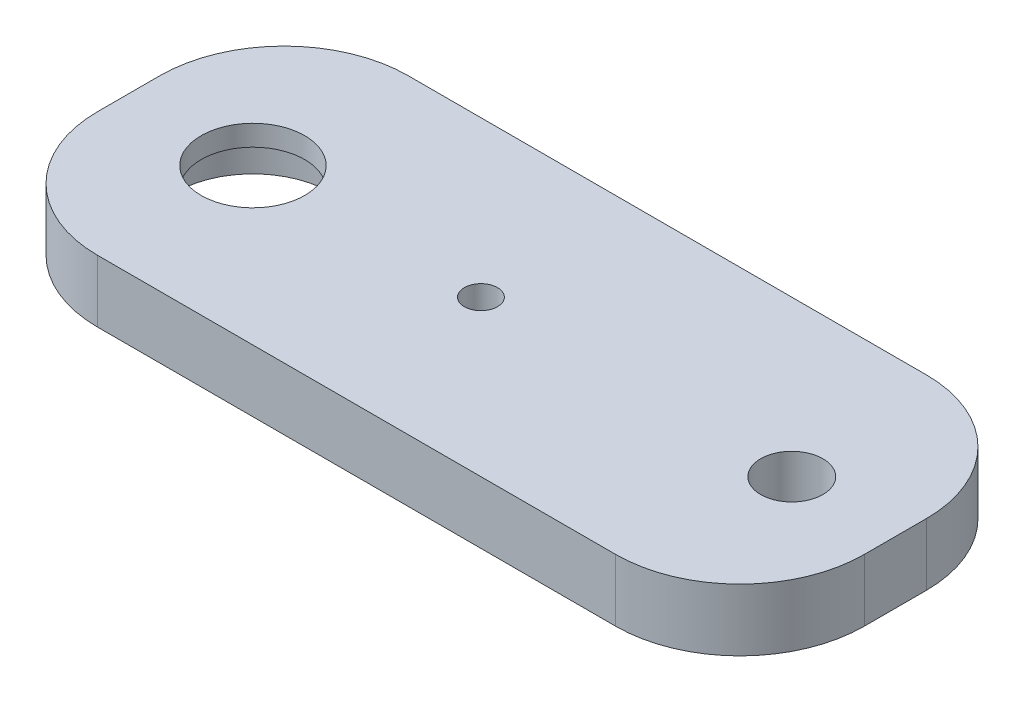
ISO-10303-21;
HEADER;
FILE_DESCRIPTION(('STEP AP214'),'2;1');
FILE_NAME('part.step','',(''),(''),'','','');
FILE_SCHEMA(('AUTOMOTIVE_DESIGN { 1 0 10303 214 1 1 1 1 }'));
ENDSEC;
DATA;
#1=APPLICATION_CONTEXT('core data for automotive mechanical design processes');
#2=APPLICATION_PROTOCOL_DEFINITION('international standard','automotive_design',2000,#1);
#3=PRODUCT_CONTEXT('',#1,'mechanical');
#4=PRODUCT('Part','Part','',(#3));
#5=PRODUCT_RELATED_PRODUCT_CATEGORY('part','',(#4));
#6=PRODUCT_DEFINITION_FORMATION('','',#4);
#7=PRODUCT_DEFINITION_CONTEXT('part definition',#1,'design');
#8=PRODUCT_DEFINITION('design','',#6,#7);
#9=PRODUCT_DEFINITION_SHAPE('','',#8);
#10=(LENGTH_UNIT() NAMED_UNIT(*) SI_UNIT(.MILLI.,.METRE.));
#11=(NAMED_UNIT(*) PLANE_ANGLE_UNIT() SI_UNIT($,.RADIAN.));
#12=(NAMED_UNIT(*) SI_UNIT($,.STERADIAN.) SOLID_ANGLE_UNIT());
#13=UNCERTAINTY_MEASURE_WITH_UNIT(LENGTH_MEASURE(1.E-05),#10,'distance_accuracy_value','');
#14=(GEOMETRIC_REPRESENTATION_CONTEXT(3) GLOBAL_UNCERTAINTY_ASSIGNED_CONTEXT((#13)) GLOBAL_UNIT_ASSIGNED_CONTEXT((#10,
#11,#12)) REPRESENTATION_CONTEXT('',''));
#15=CARTESIAN_POINT('',(0.,0.,0.));
#16=DIRECTION('',(0.,0.,1.));
#17=DIRECTION('',(1.,0.,0.));
#18=AXIS2_PLACEMENT_3D('',#15,#16,#17);
#19=CARTESIAN_POINT('',(0.,3.,0.));
#20=DIRECTION('',(0.,1.,0.));
#21=DIRECTION('',(0.,0.,1.));
#22=AXIS2_PLACEMENT_3D('',#19,#20,#21);
#23=PLANE('',#22);
#24=CARTESIAN_POINT('',(17.,3.,0.));
#25=DIRECTION('',(0.,1.,0.));
#26=DIRECTION('',(0.,0.,1.));
#27=AXIS2_PLACEMENT_3D('',#24,#25,#26);
#28=CIRCLE('',#27,1.5);
#29=CARTESIAN_POINT('',(17.,3.,1.5));
#30=VERTEX_POINT('',#29);
#31=EDGE_CURVE('E323',#30,#30,#28,.T.);
#32=ORIENTED_EDGE('',*,*,#31,.F.);
#33=EDGE_LOOP('',(#32));
#34=FACE_BOUND('',#33,.T.);
#35=CARTESIAN_POINT('',(1.99999999999999,3.,0.));
#36=DIRECTION('',(0.,1.,0.));
#37=DIRECTION('',(0.,0.,1.));
#38=AXIS2_PLACEMENT_3D('',#35,#36,#37);
#39=CIRCLE('',#38,0.8);
#40=CARTESIAN_POINT('',(1.99999999999999,3.,0.8));
#41=VERTEX_POINT('',#40);
#42=EDGE_CURVE('E157',#41,#41,#39,.F.);
#43=ORIENTED_EDGE('',*,*,#42,.T.);
#44=EDGE_LOOP('',(#43));
#45=FACE_BOUND('',#44,.T.);
#46=CARTESIAN_POINT('',(-9.00000000000001,3.,0.));
#47=DIRECTION('',(0.,1.,0.));
#48=DIRECTION('',(0.,0.,1.));
#49=AXIS2_PLACEMENT_3D('',#46,#47,#48);
#50=CIRCLE('',#49,2.5);
#51=CARTESIAN_POINT('',(-9.00000000000001,3.,2.5));
#52=VERTEX_POINT('',#51);
#53=EDGE_CURVE('E176',#52,#52,#50,.T.);
#54=ORIENTED_EDGE('',*,*,#53,.F.);
#55=EDGE_LOOP('',(#54));
#56=FACE_BOUND('',#55,.T.);
#57=DIRECTION('',(1.,0.,0.));
#58=VECTOR('',#57,1.);
#59=CARTESIAN_POINT('',(-15.,3.,7.5));
#60=LINE('',#59,#58);
#61=CARTESIAN_POINT('',(-9.,3.,7.5));
#62=VERTEX_POINT('',#61);
#63=CARTESIAN_POINT('',(16.,3.,7.5));
#64=VERTEX_POINT('',#63);
#65=EDGE_CURVE('E186',#62,#64,#60,.T.);
#66=ORIENTED_EDGE('',*,*,#65,.T.);
#67=CARTESIAN_POINT('',(16.,3.,1.5));
#68=DIRECTION('',(0.,1.,0.));
#69=DIRECTION('',(0.,0.,1.));
#70=AXIS2_PLACEMENT_3D('',#67,#68,#69);
#71=CIRCLE('',#70,6.);
#72=CARTESIAN_POINT('',(22.,3.,1.5));
#73=VERTEX_POINT('',#72);
#74=EDGE_CURVE('E47',#64,#73,#71,.T.);
#75=ORIENTED_EDGE('',*,*,#74,.T.);
#76=DIRECTION('',(0.,0.,1.));
#77=VECTOR('',#76,1.);
#78=CARTESIAN_POINT('',(22.,3.,7.5));
#79=LINE('',#78,#77);
#80=CARTESIAN_POINT('',(22.,3.,-1.5));
#81=VERTEX_POINT('',#80);
#82=EDGE_CURVE('E230',#81,#73,#79,.T.);
#83=ORIENTED_EDGE('',*,*,#82,.F.);
#84=CARTESIAN_POINT('',(16.,3.,-1.5));
#85=DIRECTION('',(0.,1.,0.));
#86=DIRECTION('',(0.,0.,1.));
#87=AXIS2_PLACEMENT_3D('',#84,#85,#86);
#88=CIRCLE('',#87,6.);
#89=CARTESIAN_POINT('',(16.,3.,-7.5));
#90=VERTEX_POINT('',#89);
#91=EDGE_CURVE('E54',#81,#90,#88,.T.);
#92=ORIENTED_EDGE('',*,*,#91,.T.);
#93=DIRECTION('',(-1.,0.,0.));
#94=VECTOR('',#93,1.);
#95=CARTESIAN_POINT('',(-15.,3.,-7.5));
#96=LINE('',#95,#94);
#97=CARTESIAN_POINT('',(-9.,3.,-7.5));
#98=VERTEX_POINT('',#97);
#99=EDGE_CURVE('E180',#90,#98,#96,.T.);
#100=ORIENTED_EDGE('',*,*,#99,.T.);
#101=CARTESIAN_POINT('',(-9.,3.,-1.5));
#102=DIRECTION('',(0.,1.,0.));
#103=DIRECTION('',(0.,0.,1.));
#104=AXIS2_PLACEMENT_3D('',#101,#102,#103);
#105=CIRCLE('',#104,6.);
#106=CARTESIAN_POINT('',(-15.,3.,-1.5));
#107=VERTEX_POINT('',#106);
#108=EDGE_CURVE('E206',#98,#107,#105,.T.);
#109=ORIENTED_EDGE('',*,*,#108,.T.);
#110=DIRECTION('',(0.,0.,1.));
#111=VECTOR('',#110,1.);
#112=CARTESIAN_POINT('',(-15.,3.,-7.5));
#113=LINE('',#112,#111);
#114=CARTESIAN_POINT('',(-15.,3.,1.5));
#115=VERTEX_POINT('',#114);
#116=EDGE_CURVE('E182',#107,#115,#113,.T.);
#117=ORIENTED_EDGE('',*,*,#116,.T.);
#118=CARTESIAN_POINT('',(-9.,3.,1.5));
#119=DIRECTION('',(0.,1.,0.));
#120=DIRECTION('',(0.,0.,1.));
#121=AXIS2_PLACEMENT_3D('',#118,#119,#120);
#122=CIRCLE('',#121,6.);
#123=EDGE_CURVE('E208',#115,#62,#122,.T.);
#124=ORIENTED_EDGE('',*,*,#123,.T.);
#125=EDGE_LOOP('',(#66,#75,#83,#92,#100,#109,#117,#124));
#126=FACE_BOUND('',#125,.T.);
#127=ADVANCED_FACE('F39',(#34,#45,#56,#126),#23,.T.);
#128=CARTESIAN_POINT('',(0.,0.,0.));
#129=DIRECTION('',(0.,1.,0.));
#130=DIRECTION('',(0.,0.,1.));
#131=AXIS2_PLACEMENT_3D('',#128,#129,#130);
#132=PLANE('',#131);
#133=CARTESIAN_POINT('',(17.,0.,0.));
#134=DIRECTION('',(0.,1.,0.));
#135=DIRECTION('',(0.,0.,1.));
#136=AXIS2_PLACEMENT_3D('',#133,#134,#135);
#137=CIRCLE('',#136,1.5);
#138=CARTESIAN_POINT('',(17.,0.,1.5));
#139=VERTEX_POINT('',#138);
#140=EDGE_CURVE('E239',#139,#139,#137,.F.);
#141=ORIENTED_EDGE('',*,*,#140,.F.);
#142=EDGE_LOOP('',(#141));
#143=FACE_BOUND('',#142,.T.);
#144=DIRECTION('',(0.,0.,1.));
#145=VECTOR('',#144,1.);
#146=CARTESIAN_POINT('',(11.,0.,-3.75));
#147=LINE('',#146,#145);
#148=CARTESIAN_POINT('',(11.,0.,-3.75));
#149=VERTEX_POINT('',#148);
#150=CARTESIAN_POINT('',(11.,0.,3.75));
#151=VERTEX_POINT('',#150);
#152=EDGE_CURVE('E136',#149,#151,#147,.T.);
#153=ORIENTED_EDGE('',*,*,#152,.F.);
#154=DIRECTION('',(1.,0.,0.));
#155=VECTOR('',#154,1.);
#156=CARTESIAN_POINT('',(-9.,0.,-3.75));
#157=LINE('',#156,#155);
#158=CARTESIAN_POINT('',(-9.,0.,-3.75));
#159=VERTEX_POINT('',#158);
#160=EDGE_CURVE('E151',#159,#149,#157,.T.);
#161=ORIENTED_EDGE('',*,*,#160,.F.);
#162=CARTESIAN_POINT('',(-9.00000000000001,0.,0.));
#163=DIRECTION('',(0.,-1.,0.));
#164=DIRECTION('',(0.,0.,-1.));
#165=AXIS2_PLACEMENT_3D('',#162,#163,#164);
#166=CIRCLE('',#165,3.75);
#167=CARTESIAN_POINT('',(-9.,0.,3.75));
#168=VERTEX_POINT('',#167);
#169=EDGE_CURVE('E166',#168,#159,#166,.T.);
#170=ORIENTED_EDGE('',*,*,#169,.F.);
#171=DIRECTION('',(-1.,0.,0.));
#172=VECTOR('',#171,1.);
#173=CARTESIAN_POINT('',(-9.,0.,3.75));
#174=LINE('',#173,#172);
#175=EDGE_CURVE('E154',#151,#168,#174,.T.);
#176=ORIENTED_EDGE('',*,*,#175,.F.);
#177=EDGE_LOOP('',(#153,#161,#170,#176));
#178=FACE_BOUND('',#177,.T.);
#179=DIRECTION('',(0.,0.,-1.));
#180=VECTOR('',#179,1.);
#181=CARTESIAN_POINT('',(22.,0.,7.5));
#182=LINE('',#181,#180);
#183=CARTESIAN_POINT('',(22.,0.,1.5));
#184=VERTEX_POINT('',#183);
#185=CARTESIAN_POINT('',(22.,0.,-1.5));
#186=VERTEX_POINT('',#185);
#187=EDGE_CURVE('E238',#184,#186,#182,.T.);
#188=ORIENTED_EDGE('',*,*,#187,.F.);
#189=CARTESIAN_POINT('',(16.,0.,1.5));
#190=DIRECTION('',(0.,1.,0.));
#191=DIRECTION('',(0.,0.,1.));
#192=AXIS2_PLACEMENT_3D('',#189,#190,#191);
#193=CIRCLE('',#192,6.);
#194=CARTESIAN_POINT('',(16.,0.,7.5));
#195=VERTEX_POINT('',#194);
#196=EDGE_CURVE('E225',#184,#195,#193,.F.);
#197=ORIENTED_EDGE('',*,*,#196,.T.);
#198=DIRECTION('',(1.,0.,0.));
#199=VECTOR('',#198,1.);
#200=CARTESIAN_POINT('',(-15.,0.,7.5));
#201=LINE('',#200,#199);
#202=CARTESIAN_POINT('',(-9.,0.,7.5));
#203=VERTEX_POINT('',#202);
#204=EDGE_CURVE('E183',#203,#195,#201,.T.);
#205=ORIENTED_EDGE('',*,*,#204,.F.);
#206=CARTESIAN_POINT('',(-9.,0.,1.5));
#207=DIRECTION('',(0.,1.,0.));
#208=DIRECTION('',(0.,0.,1.));
#209=AXIS2_PLACEMENT_3D('',#206,#207,#208);
#210=CIRCLE('',#209,6.);
#211=CARTESIAN_POINT('',(-15.,0.,1.5));
#212=VERTEX_POINT('',#211);
#213=EDGE_CURVE('E199',#203,#212,#210,.F.);
#214=ORIENTED_EDGE('',*,*,#213,.T.);
#215=DIRECTION('',(0.,0.,1.));
#216=VECTOR('',#215,1.);
#217=CARTESIAN_POINT('',(-15.,0.,-7.5));
#218=LINE('',#217,#216);
#219=CARTESIAN_POINT('',(-15.,0.,-1.5));
#220=VERTEX_POINT('',#219);
#221=EDGE_CURVE('E190',#220,#212,#218,.T.);
#222=ORIENTED_EDGE('',*,*,#221,.F.);
#223=CARTESIAN_POINT('',(-9.,0.,-1.5));
#224=DIRECTION('',(0.,1.,0.));
#225=DIRECTION('',(0.,0.,1.));
#226=AXIS2_PLACEMENT_3D('',#223,#224,#225);
#227=CIRCLE('',#226,6.);
#228=CARTESIAN_POINT('',(-9.,0.,-7.5));
#229=VERTEX_POINT('',#228);
#230=EDGE_CURVE('E196',#220,#229,#227,.F.);
#231=ORIENTED_EDGE('',*,*,#230,.T.);
#232=DIRECTION('',(-1.,0.,0.));
#233=VECTOR('',#232,1.);
#234=CARTESIAN_POINT('',(-15.,0.,-7.5));
#235=LINE('',#234,#233);
#236=CARTESIAN_POINT('',(16.,0.,-7.5));
#237=VERTEX_POINT('',#236);
#238=EDGE_CURVE('E179',#237,#229,#235,.T.);
#239=ORIENTED_EDGE('',*,*,#238,.F.);
#240=CARTESIAN_POINT('',(16.,0.,-1.5));
#241=DIRECTION('',(0.,1.,0.));
#242=DIRECTION('',(0.,0.,1.));
#243=AXIS2_PLACEMENT_3D('',#240,#241,#242);
#244=CIRCLE('',#243,6.);
#245=EDGE_CURVE('E223',#237,#186,#244,.F.);
#246=ORIENTED_EDGE('',*,*,#245,.T.);
#247=EDGE_LOOP('',(#188,#197,#205,#214,#222,#231,#239,#246));
#248=FACE_BOUND('',#247,.T.);
#249=ADVANCED_FACE('F244',(#143,#178,#248),#132,.F.);
#250=CARTESIAN_POINT('',(-9.00000000000001,-0.00100000000000013,0.));
#251=DIRECTION('',(0.,1.,0.));
#252=DIRECTION('',(0.,0.,1.));
#253=AXIS2_PLACEMENT_3D('',#250,#251,#252);
#254=CYLINDRICAL_SURFACE('',#253,2.5);
#255=CARTESIAN_POINT('',(-9.00000000000001,2.,0.));
#256=DIRECTION('',(0.,-1.,0.));
#257=DIRECTION('',(0.,0.,-1.));
#258=AXIS2_PLACEMENT_3D('',#255,#256,#257);
#259=CIRCLE('',#258,2.5);
#260=CARTESIAN_POINT('',(-9.00000000000001,2.,2.5));
#261=VERTEX_POINT('',#260);
#262=EDGE_CURVE('E173',#261,#261,#259,.F.);
#263=CARTESIAN_POINT('',(-9.00000000000001,3.,2.5));
#264=CARTESIAN_POINT('',(-9.00000000000001,2.98958333333333,2.5));
#265=CARTESIAN_POINT('',(-9.00000000000001,2.97916666666667,2.5));
#266=CARTESIAN_POINT('',(-9.00000000000001,2.95833333333333,2.5));
#267=CARTESIAN_POINT('',(-9.00000000000001,2.94791666666667,2.5));
#268=CARTESIAN_POINT('',(-9.00000000000001,2.92708333333333,2.5));
#269=CARTESIAN_POINT('',(-9.00000000000001,2.91666666666667,2.5));
#270=CARTESIAN_POINT('',(-9.00000000000001,2.89583333333333,2.5));
#271=CARTESIAN_POINT('',(-9.00000000000001,2.88541666666667,2.5));
#272=CARTESIAN_POINT('',(-9.00000000000001,2.86458333333333,2.5));
#273=CARTESIAN_POINT('',(-9.00000000000001,2.85416666666667,2.5));
#274=CARTESIAN_POINT('',(-9.00000000000001,2.83333333333333,2.5));
#275=CARTESIAN_POINT('',(-9.00000000000001,2.82291666666667,2.5));
#276=CARTESIAN_POINT('',(-9.00000000000001,2.80208333333333,2.5));
#277=CARTESIAN_POINT('',(-9.00000000000001,2.79166666666667,2.5));
#278=CARTESIAN_POINT('',(-9.00000000000001,2.77083333333333,2.5));
#279=CARTESIAN_POINT('',(-9.00000000000001,2.76041666666667,2.5));
#280=CARTESIAN_POINT('',(-9.00000000000001,2.73958333333333,2.5));
#281=CARTESIAN_POINT('',(-9.00000000000001,2.72916666666667,2.5));
#282=CARTESIAN_POINT('',(-9.00000000000001,2.70833333333333,2.5));
#283=CARTESIAN_POINT('',(-9.00000000000001,2.69791666666667,2.5));
#284=CARTESIAN_POINT('',(-9.00000000000001,2.67708333333333,2.5));
#285=CARTESIAN_POINT('',(-9.00000000000001,2.66666666666667,2.5));
#286=CARTESIAN_POINT('',(-9.00000000000001,2.64583333333333,2.5));
#287=CARTESIAN_POINT('',(-9.00000000000001,2.63541666666667,2.5));
#288=CARTESIAN_POINT('',(-9.00000000000001,2.61458333333333,2.5));
#289=CARTESIAN_POINT('',(-9.00000000000001,2.60416666666667,2.5));
#290=CARTESIAN_POINT('',(-9.00000000000001,2.58333333333333,2.5));
#291=CARTESIAN_POINT('',(-9.00000000000001,2.57291666666667,2.5));
#292=CARTESIAN_POINT('',(-9.00000000000001,2.55208333333333,2.5));
#293=CARTESIAN_POINT('',(-9.00000000000001,2.54166666666667,2.5));
#294=CARTESIAN_POINT('',(-9.00000000000001,2.52083333333333,2.5));
#295=CARTESIAN_POINT('',(-9.00000000000001,2.51041666666667,2.5));
#296=CARTESIAN_POINT('',(-9.00000000000001,2.48958333333333,2.5));
#297=CARTESIAN_POINT('',(-9.00000000000001,2.47916666666667,2.5));
#298=CARTESIAN_POINT('',(-9.00000000000001,2.45833333333333,2.5));
#299=CARTESIAN_POINT('',(-9.00000000000001,2.44791666666667,2.5));
#300=CARTESIAN_POINT('',(-9.00000000000001,2.42708333333333,2.5));
#301=CARTESIAN_POINT('',(-9.00000000000001,2.41666666666667,2.5));
#302=CARTESIAN_POINT('',(-9.00000000000001,2.39583333333333,2.5));
#303=CARTESIAN_POINT('',(-9.00000000000001,2.38541666666667,2.5));
#304=CARTESIAN_POINT('',(-9.00000000000001,2.36458333333333,2.5));
#305=CARTESIAN_POINT('',(-9.00000000000001,2.35416666666667,2.5));
#306=CARTESIAN_POINT('',(-9.00000000000001,2.33333333333333,2.5));
#307=CARTESIAN_POINT('',(-9.00000000000001,2.32291666666667,2.5));
#308=CARTESIAN_POINT('',(-9.00000000000001,2.30208333333333,2.5));
#309=CARTESIAN_POINT('',(-9.00000000000001,2.29166666666667,2.5));
#310=CARTESIAN_POINT('',(-9.00000000000001,2.27083333333333,2.5));
#311=CARTESIAN_POINT('',(-9.00000000000001,2.26041666666667,2.5));
#312=CARTESIAN_POINT('',(-9.00000000000001,2.23958333333333,2.5));
#313=CARTESIAN_POINT('',(-9.00000000000001,2.22916666666667,2.5));
#314=CARTESIAN_POINT('',(-9.00000000000001,2.20833333333333,2.5));
#315=CARTESIAN_POINT('',(-9.00000000000001,2.19791666666667,2.5));
#316=CARTESIAN_POINT('',(-9.00000000000001,2.17708333333333,2.5));
#317=CARTESIAN_POINT('',(-9.00000000000001,2.16666666666667,2.5));
#318=CARTESIAN_POINT('',(-9.00000000000001,2.14583333333333,2.5));
#319=CARTESIAN_POINT('',(-9.00000000000001,2.13541666666667,2.5));
#320=CARTESIAN_POINT('',(-9.00000000000001,2.11458333333333,2.5));
#321=CARTESIAN_POINT('',(-9.00000000000001,2.10416666666667,2.5));
#322=CARTESIAN_POINT('',(-9.00000000000001,2.08333333333333,2.5));
#323=CARTESIAN_POINT('',(-9.00000000000001,2.07291666666667,2.5));
#324=CARTESIAN_POINT('',(-9.00000000000001,2.05208333333333,2.5));
#325=CARTESIAN_POINT('',(-9.00000000000001,2.04166666666667,2.5));
#326=CARTESIAN_POINT('',(-9.00000000000001,2.02083333333333,2.5));
#327=CARTESIAN_POINT('',(-9.00000000000001,2.01041666666667,2.5));
#328=CARTESIAN_POINT('',(-9.00000000000001,2.,2.5));
#329=B_SPLINE_CURVE_WITH_KNOTS('',3,(#263,#264,#265,#266,#267,#268,#269,#270,#271,#272,#273,
#274,#275,#276,#277,#278,#279,#280,#281,#282,#283,#284,#285,#286,#287,#288,#289,#290,#291,#292,
#293,#294,#295,#296,#297,#298,#299,#300,#301,#302,#303,#304,#305,#306,#307,#308,#309,#310,#311,
#312,#313,#314,#315,#316,#317,#318,#319,#320,#321,#322,#323,#324,#325,#326,#327,#328),
.UNSPECIFIED.,.F.,.F.,(4,2,2,2,2,2,2,2,2,2,2,2,2,2,2,2,2,2,2,2,2,2,2,2,2,2,2,2,2,2,2,2,4),(0.,
0.03125,0.0625000000000001,0.0937500000000001,0.125,0.15625,0.1875,0.21875,0.25,0.28125,0.3125,
0.34375,0.374999999999999,0.40625,0.4375,0.46875,0.5,0.53125,0.5625,0.59375,0.625,0.65625,
0.687499999999999,0.718749999999999,0.749999999999999,0.781249999999999,0.812499999999999,
0.843749999999999,0.874999999999999,0.906249999999999,0.937499999999999,0.968749999999999,
0.999999999999999),.UNSPECIFIED.);
#330=EDGE_CURVE('BSEAM274',#52,#261,#329,.T.);
#331=ORIENTED_EDGE('',*,*,#53,.T.);
#332=ORIENTED_EDGE('',*,*,#262,.F.);
#333=ORIENTED_EDGE('',*,*,#330,.T.);
#334=ORIENTED_EDGE('',*,*,#330,.F.);
#335=EDGE_LOOP('',(#331,#333,#332,#334));
#336=FACE_BOUND('',#335,.T.);
#337=ADVANCED_FACE('F274',(#336),#254,.F.);
#338=CARTESIAN_POINT('',(-15.,3.,7.5));
#339=DIRECTION('',(0.,0.,-1.));
#340=DIRECTION('',(-1.,0.,0.));
#341=AXIS2_PLACEMENT_3D('',#338,#339,#340);
#342=PLANE('',#341);
#343=ORIENTED_EDGE('',*,*,#204,.T.);
#344=DIRECTION('',(0.,-1.,0.));
#345=VECTOR('',#344,1.);
#346=CARTESIAN_POINT('',(16.,3.,7.5));
#347=LINE('',#346,#345);
#348=EDGE_CURVE('E62',#195,#64,#347,.F.);
#349=ORIENTED_EDGE('',*,*,#348,.T.);
#350=ORIENTED_EDGE('',*,*,#65,.F.);
#351=DIRECTION('',(0.,-1.,0.));
#352=VECTOR('',#351,1.);
#353=CARTESIAN_POINT('',(-9.,3.,7.5));
#354=LINE('',#353,#352);
#355=EDGE_CURVE('E188',#62,#203,#354,.T.);
#356=ORIENTED_EDGE('',*,*,#355,.T.);
#357=EDGE_LOOP('',(#343,#349,#350,#356));
#358=FACE_BOUND('',#357,.T.);
#359=ADVANCED_FACE('F245',(#358),#342,.F.);
#360=CARTESIAN_POINT('',(-15.,3.,-7.5));
#361=DIRECTION('',(0.,0.,1.));
#362=DIRECTION('',(1.,0.,0.));
#363=AXIS2_PLACEMENT_3D('',#360,#361,#362);
#364=PLANE('',#363);
#365=ORIENTED_EDGE('',*,*,#99,.F.);
#366=DIRECTION('',(0.,1.,0.));
#367=VECTOR('',#366,1.);
#368=CARTESIAN_POINT('',(16.,0.,-7.5));
#369=LINE('',#368,#367);
#370=EDGE_CURVE('E11',#90,#237,#369,.F.);
#371=ORIENTED_EDGE('',*,*,#370,.T.);
#372=ORIENTED_EDGE('',*,*,#238,.T.);
#373=DIRECTION('',(0.,-1.,0.));
#374=VECTOR('',#373,1.);
#375=CARTESIAN_POINT('',(-9.,3.,-7.5));
#376=LINE('',#375,#374);
#377=EDGE_CURVE('E210',#229,#98,#376,.F.);
#378=ORIENTED_EDGE('',*,*,#377,.T.);
#379=EDGE_LOOP('',(#365,#371,#372,#378));
#380=FACE_BOUND('',#379,.T.);
#381=ADVANCED_FACE('F265',(#380),#364,.F.);
#382=CARTESIAN_POINT('',(-15.,3.,-7.5));
#383=DIRECTION('',(1.,0.,0.));
#384=DIRECTION('',(0.,0.,-1.));
#385=AXIS2_PLACEMENT_3D('',#382,#383,#384);
#386=PLANE('',#385);
#387=ORIENTED_EDGE('',*,*,#221,.T.);
#388=DIRECTION('',(0.,-1.,0.));
#389=VECTOR('',#388,1.);
#390=CARTESIAN_POINT('',(-15.,3.,1.5));
#391=LINE('',#390,#389);
#392=EDGE_CURVE('E204',#212,#115,#391,.F.);
#393=ORIENTED_EDGE('',*,*,#392,.T.);
#394=ORIENTED_EDGE('',*,*,#116,.F.);
#395=DIRECTION('',(0.,-1.,0.));
#396=VECTOR('',#395,1.);
#397=CARTESIAN_POINT('',(-15.,3.,-1.5));
#398=LINE('',#397,#396);
#399=EDGE_CURVE('E201',#107,#220,#398,.T.);
#400=ORIENTED_EDGE('',*,*,#399,.T.);
#401=EDGE_LOOP('',(#387,#393,#394,#400));
#402=FACE_BOUND('',#401,.T.);
#403=ADVANCED_FACE('F253',(#402),#386,.F.);
#404=CARTESIAN_POINT('',(-9.,3.,1.5));
#405=DIRECTION('',(0.,-1.,0.));
#406=DIRECTION('',(0.,0.,-1.));
#407=AXIS2_PLACEMENT_3D('',#404,#405,#406);
#408=CYLINDRICAL_SURFACE('',#407,6.);
#409=ORIENTED_EDGE('',*,*,#123,.F.);
#410=ORIENTED_EDGE('',*,*,#392,.F.);
#411=ORIENTED_EDGE('',*,*,#213,.F.);
#412=ORIENTED_EDGE('',*,*,#355,.F.);
#413=EDGE_LOOP('',(#409,#410,#411,#412));
#414=FACE_BOUND('',#413,.T.);
#415=ADVANCED_FACE('F249',(#414),#408,.T.);
#416=CARTESIAN_POINT('',(-9.,3.,-1.5));
#417=DIRECTION('',(0.,-1.,0.));
#418=DIRECTION('',(0.,0.,-1.));
#419=AXIS2_PLACEMENT_3D('',#416,#417,#418);
#420=CYLINDRICAL_SURFACE('',#419,6.);
#421=ORIENTED_EDGE('',*,*,#108,.F.);
#422=ORIENTED_EDGE('',*,*,#377,.F.);
#423=ORIENTED_EDGE('',*,*,#230,.F.);
#424=ORIENTED_EDGE('',*,*,#399,.F.);
#425=EDGE_LOOP('',(#421,#422,#423,#424));
#426=FACE_BOUND('',#425,.T.);
#427=ADVANCED_FACE('F258',(#426),#420,.T.);
#428=CARTESIAN_POINT('',(-9.00000000000001,2.,0.));
#429=DIRECTION('',(0.,-1.,0.));
#430=DIRECTION('',(0.,0.,-1.));
#431=AXIS2_PLACEMENT_3D('',#428,#429,#430);
#432=PLANE('',#431);
#433=CARTESIAN_POINT('',(-9.00000000000001,2.,0.));
#434=DIRECTION('',(0.,-1.,0.));
#435=DIRECTION('',(0.,0.,-1.));
#436=AXIS2_PLACEMENT_3D('',#433,#434,#435);
#437=CIRCLE('',#436,3.75);
#438=CARTESIAN_POINT('',(-9.00000000000001,2.,-3.75));
#439=VERTEX_POINT('',#438);
#440=EDGE_CURVE('E170',#439,#439,#437,.T.);
#441=ORIENTED_EDGE('',*,*,#440,.T.);
#442=EDGE_LOOP('',(#441));
#443=FACE_BOUND('',#442,.T.);
#444=ORIENTED_EDGE('',*,*,#262,.T.);
#445=EDGE_LOOP('',(#444));
#446=FACE_BOUND('',#445,.T.);
#447=ADVANCED_FACE('F295',(#443,#446),#432,.T.);
#448=CARTESIAN_POINT('',(-9.00000000000001,2.,0.));
#449=DIRECTION('',(0.,-1.,0.));
#450=DIRECTION('',(0.,0.,-1.));
#451=AXIS2_PLACEMENT_3D('',#448,#449,#450);
#452=CYLINDRICAL_SURFACE('',#451,3.75);
#453=ORIENTED_EDGE('',*,*,#440,.F.);
#454=EDGE_LOOP('',(#453));
#455=FACE_BOUND('',#454,.T.);
#456=ORIENTED_EDGE('',*,*,#169,.T.);
#457=DIRECTION('',(0.,-1.,0.));
#458=VECTOR('',#457,1.);
#459=CARTESIAN_POINT('',(-9.,1.,-3.75));
#460=LINE('',#459,#458);
#461=CARTESIAN_POINT('',(-9.,1.,-3.75));
#462=VERTEX_POINT('',#461);
#463=EDGE_CURVE('E167',#462,#159,#460,.T.);
#464=ORIENTED_EDGE('',*,*,#463,.F.);
#465=CARTESIAN_POINT('',(-9.00000000000001,1.,0.));
#466=DIRECTION('',(0.,1.,0.));
#467=DIRECTION('',(0.,0.,1.));
#468=AXIS2_PLACEMENT_3D('',#465,#466,#467);
#469=CIRCLE('',#468,3.75);
#470=CARTESIAN_POINT('',(-9.00000000000001,1.,3.75));
#471=VERTEX_POINT('',#470);
#472=EDGE_CURVE('E213',#462,#471,#469,.F.);
#473=ORIENTED_EDGE('',*,*,#472,.T.);
#474=DIRECTION('',(0.,-1.,0.));
#475=VECTOR('',#474,1.);
#476=CARTESIAN_POINT('',(-9.,1.,3.75));
#477=LINE('',#476,#475);
#478=EDGE_CURVE('E139',#471,#168,#477,.T.);
#479=ORIENTED_EDGE('',*,*,#478,.T.);
#480=EDGE_LOOP('',(#456,#464,#473,#479));
#481=FACE_BOUND('',#480,.T.);
#482=ADVANCED_FACE('F292',(#455,#481),#452,.F.);
#483=CARTESIAN_POINT('',(0.,1.,0.));
#484=DIRECTION('',(0.,1.,0.));
#485=DIRECTION('',(0.,0.,1.));
#486=AXIS2_PLACEMENT_3D('',#483,#484,#485);
#487=PLANE('',#486);
#488=CARTESIAN_POINT('',(1.99999999999999,1.,0.));
#489=DIRECTION('',(0.,-1.,0.));
#490=DIRECTION('',(0.,0.,-1.));
#491=AXIS2_PLACEMENT_3D('',#488,#489,#490);
#492=CIRCLE('',#491,0.8);
#493=CARTESIAN_POINT('',(1.99999999999999,1.,-0.8));
#494=VERTEX_POINT('',#493);
#495=EDGE_CURVE('E162',#494,#494,#492,.T.);
#496=ORIENTED_EDGE('',*,*,#495,.F.);
#497=EDGE_LOOP('',(#496));
#498=FACE_BOUND('',#497,.T.);
#499=DIRECTION('',(1.,0.,0.));
#500=VECTOR('',#499,1.);
#501=CARTESIAN_POINT('',(-9.,1.,-3.75));
#502=LINE('',#501,#500);
#503=CARTESIAN_POINT('',(11.,1.,-3.75));
#504=VERTEX_POINT('',#503);
#505=EDGE_CURVE('E140',#462,#504,#502,.T.);
#506=ORIENTED_EDGE('',*,*,#505,.T.);
#507=DIRECTION('',(0.,0.,1.));
#508=VECTOR('',#507,1.);
#509=CARTESIAN_POINT('',(11.,1.,-3.75));
#510=LINE('',#509,#508);
#511=CARTESIAN_POINT('',(11.,1.,3.75));
#512=VERTEX_POINT('',#511);
#513=EDGE_CURVE('E133',#504,#512,#510,.T.);
#514=ORIENTED_EDGE('',*,*,#513,.T.);
#515=DIRECTION('',(-1.,0.,0.));
#516=VECTOR('',#515,1.);
#517=CARTESIAN_POINT('',(-9.,1.,3.75));
#518=LINE('',#517,#516);
#519=EDGE_CURVE('E143',#512,#471,#518,.T.);
#520=ORIENTED_EDGE('',*,*,#519,.T.);
#521=ORIENTED_EDGE('',*,*,#472,.F.);
#522=EDGE_LOOP('',(#506,#514,#520,#521));
#523=FACE_BOUND('',#522,.T.);
#524=ADVANCED_FACE('F149',(#498,#523),#487,.F.);
#525=CARTESIAN_POINT('',(11.,1.,-3.75));
#526=DIRECTION('',(1.,0.,0.));
#527=DIRECTION('',(0.,0.,-1.));
#528=AXIS2_PLACEMENT_3D('',#525,#526,#527);
#529=PLANE('',#528);
#530=ORIENTED_EDGE('',*,*,#152,.T.);
#531=DIRECTION('',(0.,-1.,0.));
#532=VECTOR('',#531,1.);
#533=CARTESIAN_POINT('',(11.,1.,3.75));
#534=LINE('',#533,#532);
#535=EDGE_CURVE('E129',#512,#151,#534,.T.);
#536=ORIENTED_EDGE('',*,*,#535,.F.);
#537=ORIENTED_EDGE('',*,*,#513,.F.);
#538=DIRECTION('',(0.,-1.,0.));
#539=VECTOR('',#538,1.);
#540=CARTESIAN_POINT('',(11.,1.,-3.75));
#541=LINE('',#540,#539);
#542=EDGE_CURVE('E164',#504,#149,#541,.T.);
#543=ORIENTED_EDGE('',*,*,#542,.T.);
#544=EDGE_LOOP('',(#530,#536,#537,#543));
#545=FACE_BOUND('',#544,.T.);
#546=ADVANCED_FACE('F131',(#545),#529,.F.);
#547=CARTESIAN_POINT('',(-9.,1.,-3.75));
#548=DIRECTION('',(0.,0.,-1.));
#549=DIRECTION('',(-1.,0.,0.));
#550=AXIS2_PLACEMENT_3D('',#547,#548,#549);
#551=PLANE('',#550);
#552=ORIENTED_EDGE('',*,*,#160,.T.);
#553=ORIENTED_EDGE('',*,*,#542,.F.);
#554=ORIENTED_EDGE('',*,*,#505,.F.);
#555=ORIENTED_EDGE('',*,*,#463,.T.);
#556=EDGE_LOOP('',(#552,#553,#554,#555));
#557=FACE_BOUND('',#556,.T.);
#558=ADVANCED_FACE('F302',(#557),#551,.F.);
#559=CARTESIAN_POINT('',(-9.,1.,3.75));
#560=DIRECTION('',(0.,0.,1.));
#561=DIRECTION('',(1.,0.,0.));
#562=AXIS2_PLACEMENT_3D('',#559,#560,#561);
#563=PLANE('',#562);
#564=ORIENTED_EDGE('',*,*,#175,.T.);
#565=ORIENTED_EDGE('',*,*,#478,.F.);
#566=ORIENTED_EDGE('',*,*,#519,.F.);
#567=ORIENTED_EDGE('',*,*,#535,.T.);
#568=EDGE_LOOP('',(#564,#565,#566,#567));
#569=FACE_BOUND('',#568,.T.);
#570=ADVANCED_FACE('F144',(#569),#563,.F.);
#571=CARTESIAN_POINT('',(1.99999999999999,3.001,0.));
#572=DIRECTION('',(0.,-1.,0.));
#573=DIRECTION('',(0.,0.,-1.));
#574=AXIS2_PLACEMENT_3D('',#571,#572,#573);
#575=CYLINDRICAL_SURFACE('',#574,0.8);
#576=ORIENTED_EDGE('',*,*,#42,.F.);
#577=EDGE_LOOP('',(#576));
#578=FACE_BOUND('',#577,.T.);
#579=ORIENTED_EDGE('',*,*,#495,.T.);
#580=EDGE_LOOP('',(#579));
#581=FACE_BOUND('',#580,.T.);
#582=ADVANCED_FACE('F305',(#578,#581),#575,.F.);
#583=CARTESIAN_POINT('',(22.,0.,0.));
#584=DIRECTION('',(1.,0.,0.));
#585=DIRECTION('',(0.,0.,-1.));
#586=AXIS2_PLACEMENT_3D('',#583,#584,#585);
#587=PLANE('',#586);
#588=ORIENTED_EDGE('',*,*,#82,.T.);
#589=DIRECTION('',(0.,-1.,0.));
#590=VECTOR('',#589,1.);
#591=CARTESIAN_POINT('',(22.,0.,1.5));
#592=LINE('',#591,#590);
#593=EDGE_CURVE('E220',#73,#184,#592,.T.);
#594=ORIENTED_EDGE('',*,*,#593,.T.);
#595=ORIENTED_EDGE('',*,*,#187,.T.);
#596=DIRECTION('',(0.,1.,0.));
#597=VECTOR('',#596,1.);
#598=CARTESIAN_POINT('',(22.,3.,-1.5));
#599=LINE('',#598,#597);
#600=EDGE_CURVE('E217',#186,#81,#599,.T.);
#601=ORIENTED_EDGE('',*,*,#600,.T.);
#602=EDGE_LOOP('',(#588,#594,#595,#601));
#603=FACE_BOUND('',#602,.T.);
#604=ADVANCED_FACE('F234',(#603),#587,.T.);
#605=CARTESIAN_POINT('',(17.,-0.00100000000000013,0.));
#606=DIRECTION('',(0.,1.,0.));
#607=DIRECTION('',(0.,0.,1.));
#608=AXIS2_PLACEMENT_3D('',#605,#606,#607);
#609=CYLINDRICAL_SURFACE('',#608,1.5);
#610=CARTESIAN_POINT('',(17.,3.,1.5));
#611=CARTESIAN_POINT('',(17.,2.96875,1.5));
#612=CARTESIAN_POINT('',(17.,2.9375,1.5));
#613=CARTESIAN_POINT('',(17.,2.875,1.5));
#614=CARTESIAN_POINT('',(17.,2.84375,1.5));
#615=CARTESIAN_POINT('',(17.,2.78125,1.5));
#616=CARTESIAN_POINT('',(17.,2.75,1.5));
#617=CARTESIAN_POINT('',(17.,2.6875,1.5));
#618=CARTESIAN_POINT('',(17.,2.65625,1.5));
#619=CARTESIAN_POINT('',(17.,2.59375,1.5));
#620=CARTESIAN_POINT('',(17.,2.5625,1.5));
#621=CARTESIAN_POINT('',(17.,2.5,1.5));
#622=CARTESIAN_POINT('',(17.,2.46875,1.5));
#623=CARTESIAN_POINT('',(17.,2.40625,1.5));
#624=CARTESIAN_POINT('',(17.,2.375,1.5));
#625=CARTESIAN_POINT('',(17.,2.3125,1.5));
#626=CARTESIAN_POINT('',(17.,2.28125,1.5));
#627=CARTESIAN_POINT('',(17.,2.21875,1.5));
#628=CARTESIAN_POINT('',(17.,2.1875,1.5));
#629=CARTESIAN_POINT('',(17.,2.125,1.5));
#630=CARTESIAN_POINT('',(17.,2.09375,1.5));
#631=CARTESIAN_POINT('',(17.,2.03125,1.5));
#632=CARTESIAN_POINT('',(17.,2.,1.5));
#633=CARTESIAN_POINT('',(17.,1.9375,1.5));
#634=CARTESIAN_POINT('',(17.,1.90625,1.5));
#635=CARTESIAN_POINT('',(17.,1.84375,1.5));
#636=CARTESIAN_POINT('',(17.,1.8125,1.5));
#637=CARTESIAN_POINT('',(17.,1.75,1.5));
#638=CARTESIAN_POINT('',(17.,1.71875,1.5));
#639=CARTESIAN_POINT('',(17.,1.65625,1.5));
#640=CARTESIAN_POINT('',(17.,1.625,1.5));
#641=CARTESIAN_POINT('',(17.,1.5625,1.5));
#642=CARTESIAN_POINT('',(17.,1.53125,1.5));
#643=CARTESIAN_POINT('',(17.,1.46875,1.5));
#644=CARTESIAN_POINT('',(17.,1.4375,1.5));
#645=CARTESIAN_POINT('',(17.,1.375,1.5));
#646=CARTESIAN_POINT('',(17.,1.34375,1.5));
#647=CARTESIAN_POINT('',(17.,1.28125,1.5));
#648=CARTESIAN_POINT('',(17.,1.25,1.5));
#649=CARTESIAN_POINT('',(17.,1.1875,1.5));
#650=CARTESIAN_POINT('',(17.,1.15625,1.5));
#651=CARTESIAN_POINT('',(17.,1.09375,1.5));
#652=CARTESIAN_POINT('',(17.,1.0625,1.5));
#653=CARTESIAN_POINT('',(17.,1.,1.5));
#654=CARTESIAN_POINT('',(17.,0.96875,1.5));
#655=CARTESIAN_POINT('',(17.,0.90625,1.5));
#656=CARTESIAN_POINT('',(17.,0.875,1.5));
#657=CARTESIAN_POINT('',(17.,0.8125,1.5));
#658=CARTESIAN_POINT('',(17.,0.78125,1.5));
#659=CARTESIAN_POINT('',(17.,0.71875,1.5));
#660=CARTESIAN_POINT('',(17.,0.6875,1.5));
#661=CARTESIAN_POINT('',(17.,0.625,1.5));
#662=CARTESIAN_POINT('',(17.,0.59375,1.5));
#663=CARTESIAN_POINT('',(17.,0.53125,1.5));
#664=CARTESIAN_POINT('',(17.,0.5,1.5));
#665=CARTESIAN_POINT('',(17.,0.4375,1.5));
#666=CARTESIAN_POINT('',(17.,0.40625,1.5));
#667=CARTESIAN_POINT('',(17.,0.34375,1.5));
#668=CARTESIAN_POINT('',(17.,0.3125,1.5));
#669=CARTESIAN_POINT('',(17.,0.25,1.5));
#670=CARTESIAN_POINT('',(17.,0.21875,1.5));
#671=CARTESIAN_POINT('',(17.,0.15625,1.5));
#672=CARTESIAN_POINT('',(17.,0.125,1.5));
#673=CARTESIAN_POINT('',(17.,0.0625000000000001,1.5));
#674=CARTESIAN_POINT('',(17.,0.0312500000000001,1.5));
#675=CARTESIAN_POINT('',(17.,0.,1.5));
#676=B_SPLINE_CURVE_WITH_KNOTS('',3,(#610,#611,#612,#613,#614,#615,#616,#617,#618,#619,#620,
#621,#622,#623,#624,#625,#626,#627,#628,#629,#630,#631,#632,#633,#634,#635,#636,#637,#638,#639,
#640,#641,#642,#643,#644,#645,#646,#647,#648,#649,#650,#651,#652,#653,#654,#655,#656,#657,#658,
#659,#660,#661,#662,#663,#664,#665,#666,#667,#668,#669,#670,#671,#672,#673,#674,#675),
.UNSPECIFIED.,.F.,.F.,(4,2,2,2,2,2,2,2,2,2,2,2,2,2,2,2,2,2,2,2,2,2,2,2,2,2,2,2,2,2,2,2,4),(0.,
0.0937500000000001,0.1875,0.28125,0.375,0.46875,0.5625,0.65625,0.75,0.84375,0.9375,1.03125,
1.125,1.21875,1.3125,1.40625,1.5,1.59375,1.6875,1.78125,1.875,1.96875,2.0625,2.15625,2.25,
2.34375,2.4375,2.53125,2.625,2.71875,2.8125,2.90625,3.),.UNSPECIFIED.);
#677=EDGE_CURVE('BSEAM315',#30,#139,#676,.T.);
#678=ORIENTED_EDGE('',*,*,#31,.T.);
#679=ORIENTED_EDGE('',*,*,#140,.T.);
#680=ORIENTED_EDGE('',*,*,#677,.T.);
#681=ORIENTED_EDGE('',*,*,#677,.F.);
#682=EDGE_LOOP('',(#678,#680,#679,#681));
#683=FACE_BOUND('',#682,.T.);
#684=ADVANCED_FACE('F315',(#683),#609,.F.);
#685=CARTESIAN_POINT('',(16.,0.,1.5));
#686=DIRECTION('',(0.,1.,0.));
#687=DIRECTION('',(0.,0.,1.));
#688=AXIS2_PLACEMENT_3D('',#685,#686,#687);
#689=CYLINDRICAL_SURFACE('',#688,6.);
#690=ORIENTED_EDGE('',*,*,#74,.F.);
#691=ORIENTED_EDGE('',*,*,#348,.F.);
#692=ORIENTED_EDGE('',*,*,#196,.F.);
#693=ORIENTED_EDGE('',*,*,#593,.F.);
#694=EDGE_LOOP('',(#690,#691,#692,#693));
#695=FACE_BOUND('',#694,.T.);
#696=ADVANCED_FACE('F241',(#695),#689,.T.);
#697=CARTESIAN_POINT('',(16.,0.,-1.5));
#698=DIRECTION('',(0.,-1.,0.));
#699=DIRECTION('',(0.,0.,-1.));
#700=AXIS2_PLACEMENT_3D('',#697,#698,#699);
#701=CYLINDRICAL_SURFACE('',#700,6.);
#702=ORIENTED_EDGE('',*,*,#245,.F.);
#703=ORIENTED_EDGE('',*,*,#370,.F.);
#704=ORIENTED_EDGE('',*,*,#91,.F.);
#705=ORIENTED_EDGE('',*,*,#600,.F.);
#706=EDGE_LOOP('',(#702,#703,#704,#705));
#707=FACE_BOUND('',#706,.T.);
#708=ADVANCED_FACE('F41',(#707),#701,.T.);
#709=CLOSED_SHELL('',(#127,#249,#337,#359,#381,#403,#415,#427,#447,#482,#524,#546,#558,#570,
#582,#604,#684,#696,#708));
#710=MANIFOLD_SOLID_BREP('B2',#709);
#711=ADVANCED_BREP_SHAPE_REPRESENTATION('',(#18,#710),#14);
#712=SHAPE_DEFINITION_REPRESENTATION(#9,#711);
ENDSEC;
END-ISO-10303-21;
